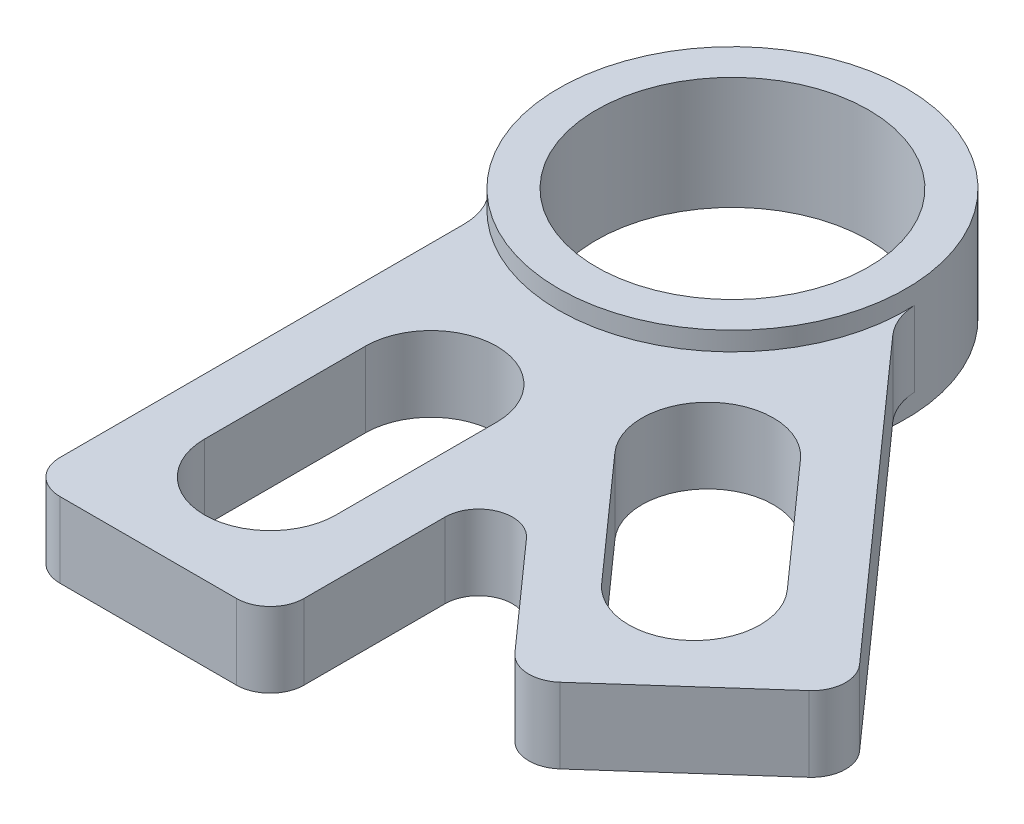
ISO-10303-21;
HEADER;
FILE_DESCRIPTION(('STEP AP214'),'2;1');
FILE_NAME('part.step','',(''),(''),'','','');
FILE_SCHEMA(('AUTOMOTIVE_DESIGN { 1 0 10303 214 1 1 1 1 }'));
ENDSEC;
DATA;
#1=APPLICATION_CONTEXT('core data for automotive mechanical design processes');
#2=APPLICATION_PROTOCOL_DEFINITION('international standard','automotive_design',2000,#1);
#3=PRODUCT_CONTEXT('',#1,'mechanical');
#4=PRODUCT('Part','Part','',(#3));
#5=PRODUCT_RELATED_PRODUCT_CATEGORY('part','',(#4));
#6=PRODUCT_DEFINITION_FORMATION('','',#4);
#7=PRODUCT_DEFINITION_CONTEXT('part definition',#1,'design');
#8=PRODUCT_DEFINITION('design','',#6,#7);
#9=PRODUCT_DEFINITION_SHAPE('','',#8);
#10=(LENGTH_UNIT() NAMED_UNIT(*) SI_UNIT(.MILLI.,.METRE.));
#11=(NAMED_UNIT(*) PLANE_ANGLE_UNIT() SI_UNIT($,.RADIAN.));
#12=(NAMED_UNIT(*) SI_UNIT($,.STERADIAN.) SOLID_ANGLE_UNIT());
#13=UNCERTAINTY_MEASURE_WITH_UNIT(LENGTH_MEASURE(1.E-05),#10,'distance_accuracy_value','');
#14=(GEOMETRIC_REPRESENTATION_CONTEXT(3) GLOBAL_UNCERTAINTY_ASSIGNED_CONTEXT((#13)) GLOBAL_UNIT_ASSIGNED_CONTEXT((#10,
#11,#12)) REPRESENTATION_CONTEXT('',''));
#15=CARTESIAN_POINT('',(0.,0.,0.));
#16=DIRECTION('',(0.,0.,1.));
#17=DIRECTION('',(1.,0.,0.));
#18=AXIS2_PLACEMENT_3D('',#15,#16,#17);
#19=CARTESIAN_POINT('',(0.,4.7625,0.));
#20=DIRECTION('',(0.,-1.,0.));
#21=DIRECTION('',(0.,0.,-1.));
#22=AXIS2_PLACEMENT_3D('',#19,#20,#21);
#23=CYLINDRICAL_SURFACE('',#22,11.5062);
#24=CARTESIAN_POINT('',(0.,4.7625,0.));
#25=DIRECTION('',(0.,1.,0.));
#26=DIRECTION('',(0.,0.,1.));
#27=AXIS2_PLACEMENT_3D('',#24,#25,#26);
#28=CIRCLE('',#27,11.5062);
#29=CARTESIAN_POINT('',(0.,4.7625,-11.5062));
#30=VERTEX_POINT('',#29);
#31=EDGE_CURVE('E301',#30,#30,#28,.T.);
#32=CARTESIAN_POINT('',(0.,-4.7625,0.));
#33=DIRECTION('',(0.,1.,0.));
#34=DIRECTION('',(0.,0.,1.));
#35=AXIS2_PLACEMENT_3D('',#32,#33,#34);
#36=CIRCLE('',#35,11.5062);
#37=CARTESIAN_POINT('',(0.,-4.7625,-11.5062));
#38=VERTEX_POINT('',#37);
#39=EDGE_CURVE('E296',#38,#38,#36,.T.);
#40=CARTESIAN_POINT('',(0.,4.7625,-11.5062));
#41=CARTESIAN_POINT('',(0.,4.66328125,-11.5062));
#42=CARTESIAN_POINT('',(0.,4.5640625,-11.5062));
#43=CARTESIAN_POINT('',(0.,4.365625,-11.5062));
#44=CARTESIAN_POINT('',(0.,4.26640625,-11.5062));
#45=CARTESIAN_POINT('',(0.,4.06796875,-11.5062));
#46=CARTESIAN_POINT('',(0.,3.96875,-11.5062));
#47=CARTESIAN_POINT('',(0.,3.7703125,-11.5062));
#48=CARTESIAN_POINT('',(0.,3.67109375,-11.5062));
#49=CARTESIAN_POINT('',(0.,3.47265625,-11.5062));
#50=CARTESIAN_POINT('',(0.,3.3734375,-11.5062));
#51=CARTESIAN_POINT('',(0.,3.175,-11.5062));
#52=CARTESIAN_POINT('',(0.,3.07578125,-11.5062));
#53=CARTESIAN_POINT('',(0.,2.87734375,-11.5062));
#54=CARTESIAN_POINT('',(0.,2.778125,-11.5062));
#55=CARTESIAN_POINT('',(0.,2.5796875,-11.5062));
#56=CARTESIAN_POINT('',(0.,2.48046875,-11.5062));
#57=CARTESIAN_POINT('',(0.,2.28203125,-11.5062));
#58=CARTESIAN_POINT('',(0.,2.1828125,-11.5062));
#59=CARTESIAN_POINT('',(0.,1.984375,-11.5062));
#60=CARTESIAN_POINT('',(0.,1.88515625,-11.5062));
#61=CARTESIAN_POINT('',(0.,1.68671875,-11.5062));
#62=CARTESIAN_POINT('',(0.,1.5875,-11.5062));
#63=CARTESIAN_POINT('',(0.,1.3890625,-11.5062));
#64=CARTESIAN_POINT('',(0.,1.28984375,-11.5062));
#65=CARTESIAN_POINT('',(0.,1.09140625,-11.5062));
#66=CARTESIAN_POINT('',(0.,0.992187499999999,-11.5062));
#67=CARTESIAN_POINT('',(0.,0.79375,-11.5062));
#68=CARTESIAN_POINT('',(0.,0.69453125,-11.5062));
#69=CARTESIAN_POINT('',(0.,0.49609375,-11.5062));
#70=CARTESIAN_POINT('',(0.,0.396875,-11.5062));
#71=CARTESIAN_POINT('',(0.,0.1984375,-11.5062));
#72=CARTESIAN_POINT('',(0.,0.0992187500000001,-11.5062));
#73=CARTESIAN_POINT('',(0.,-0.0992187500000001,-11.5062));
#74=CARTESIAN_POINT('',(0.,-0.1984375,-11.5062));
#75=CARTESIAN_POINT('',(0.,-0.396875,-11.5062));
#76=CARTESIAN_POINT('',(0.,-0.49609375,-11.5062));
#77=CARTESIAN_POINT('',(0.,-0.69453125,-11.5062));
#78=CARTESIAN_POINT('',(0.,-0.793750000000001,-11.5062));
#79=CARTESIAN_POINT('',(0.,-0.992187500000001,-11.5062));
#80=CARTESIAN_POINT('',(0.,-1.09140625,-11.5062));
#81=CARTESIAN_POINT('',(0.,-1.28984375,-11.5062));
#82=CARTESIAN_POINT('',(0.,-1.3890625,-11.5062));
#83=CARTESIAN_POINT('',(0.,-1.5875,-11.5062));
#84=CARTESIAN_POINT('',(0.,-1.68671875,-11.5062));
#85=CARTESIAN_POINT('',(0.,-1.88515625,-11.5062));
#86=CARTESIAN_POINT('',(0.,-1.984375,-11.5062));
#87=CARTESIAN_POINT('',(0.,-2.1828125,-11.5062));
#88=CARTESIAN_POINT('',(0.,-2.28203125,-11.5062));
#89=CARTESIAN_POINT('',(0.,-2.48046875,-11.5062));
#90=CARTESIAN_POINT('',(0.,-2.5796875,-11.5062));
#91=CARTESIAN_POINT('',(0.,-2.778125,-11.5062));
#92=CARTESIAN_POINT('',(0.,-2.87734375,-11.5062));
#93=CARTESIAN_POINT('',(0.,-3.07578125,-11.5062));
#94=CARTESIAN_POINT('',(0.,-3.175,-11.5062));
#95=CARTESIAN_POINT('',(0.,-3.3734375,-11.5062));
#96=CARTESIAN_POINT('',(0.,-3.47265625,-11.5062));
#97=CARTESIAN_POINT('',(0.,-3.67109375,-11.5062));
#98=CARTESIAN_POINT('',(0.,-3.7703125,-11.5062));
#99=CARTESIAN_POINT('',(0.,-3.96875,-11.5062));
#100=CARTESIAN_POINT('',(0.,-4.06796875,-11.5062));
#101=CARTESIAN_POINT('',(0.,-4.26640625,-11.5062));
#102=CARTESIAN_POINT('',(0.,-4.365625,-11.5062));
#103=CARTESIAN_POINT('',(0.,-4.5640625,-11.5062));
#104=CARTESIAN_POINT('',(0.,-4.66328125,-11.5062));
#105=CARTESIAN_POINT('',(0.,-4.7625,-11.5062));
#106=B_SPLINE_CURVE_WITH_KNOTS('',3,(#40,#41,#42,#43,#44,#45,#46,#47,#48,#49,#50,#51,#52,#53,
#54,#55,#56,#57,#58,#59,#60,#61,#62,#63,#64,#65,#66,#67,#68,#69,#70,#71,#72,#73,#74,#75,#76,#77,
#78,#79,#80,#81,#82,#83,#84,#85,#86,#87,#88,#89,#90,#91,#92,#93,#94,#95,#96,#97,#98,#99,#100,
#101,#102,#103,#104,#105),.UNSPECIFIED.,.F.,.F.,(4,2,2,2,2,2,2,2,2,2,2,2,2,2,2,2,2,2,2,2,2,2,2,
2,2,2,2,2,2,2,2,2,4),(0.,0.29765625,0.5953125,0.892968750000001,1.190625,1.48828125,1.7859375,
2.08359375,2.38125,2.67890625,2.9765625,3.27421875,3.571875,3.86953125,4.1671875,4.46484375,
4.7625,5.06015625,5.3578125,5.65546875,5.953125,6.25078125,6.5484375,6.84609375,7.14375,
7.44140625,7.7390625,8.03671875,8.334375,8.63203125,8.9296875,9.22734375,9.525),.UNSPECIFIED.);
#107=EDGE_CURVE('BSEAM43',#30,#38,#106,.T.);
#108=ORIENTED_EDGE('',*,*,#31,.T.);
#109=ORIENTED_EDGE('',*,*,#39,.F.);
#110=ORIENTED_EDGE('',*,*,#107,.T.);
#111=ORIENTED_EDGE('',*,*,#107,.F.);
#112=EDGE_LOOP('',(#108,#110,#109,#111));
#113=FACE_BOUND('',#112,.T.);
#114=ADVANCED_FACE('F43',(#113),#23,.F.);
#115=CARTESIAN_POINT('',(0.,4.7625,0.));
#116=DIRECTION('',(0.,-1.,0.));
#117=DIRECTION('',(0.,0.,-1.));
#118=AXIS2_PLACEMENT_3D('',#115,#116,#117);
#119=CYLINDRICAL_SURFACE('',#118,14.6812);
#120=DIRECTION('',(0.,-1.,0.));
#121=VECTOR('',#120,1.);
#122=CARTESIAN_POINT('',(14.6629051138909,4.7625,-0.7326984789337));
#123=LINE('',#122,#121);
#124=CARTESIAN_POINT('',(14.6629051138909,3.175,-0.7326984789337));
#125=VERTEX_POINT('',#124);
#126=CARTESIAN_POINT('',(14.6629051138909,-3.175,-0.7326984789337));
#127=VERTEX_POINT('',#126);
#128=EDGE_CURVE('E315',#125,#127,#123,.T.);
#129=ORIENTED_EDGE('',*,*,#128,.T.);
#130=CARTESIAN_POINT('',(0.,-3.175,0.));
#131=DIRECTION('',(0.,1.,0.));
#132=DIRECTION('',(0.,0.,1.));
#133=AXIS2_PLACEMENT_3D('',#130,#131,#132);
#134=CIRCLE('',#133,14.6812);
#135=CARTESIAN_POINT('',(-11.4402024421594,-3.175,9.20105437014751));
#136=VERTEX_POINT('',#135);
#137=EDGE_CURVE('E272',#136,#127,#134,.T.);
#138=ORIENTED_EDGE('',*,*,#137,.F.);
#139=DIRECTION('',(0.,-1.,0.));
#140=VECTOR('',#139,1.);
#141=CARTESIAN_POINT('',(-11.4402024421594,4.7625,9.20105437014751));
#142=LINE('',#141,#140);
#143=CARTESIAN_POINT('',(-11.4402024421594,3.175,9.20105437014751));
#144=VERTEX_POINT('',#143);
#145=EDGE_CURVE('E308',#136,#144,#142,.F.);
#146=ORIENTED_EDGE('',*,*,#145,.T.);
#147=CARTESIAN_POINT('',(0.,3.175,0.));
#148=DIRECTION('',(0.,1.,0.));
#149=DIRECTION('',(0.,0.,1.));
#150=AXIS2_PLACEMENT_3D('',#147,#148,#149);
#151=CIRCLE('',#150,14.6812);
#152=EDGE_CURVE('E234',#144,#125,#151,.T.);
#153=ORIENTED_EDGE('',*,*,#152,.T.);
#154=EDGE_LOOP('',(#129,#138,#146,#153));
#155=FACE_BOUND('',#154,.T.);
#156=CARTESIAN_POINT('',(0.,4.7625,0.));
#157=DIRECTION('',(0.,1.,0.));
#158=DIRECTION('',(0.,0.,1.));
#159=AXIS2_PLACEMENT_3D('',#156,#157,#158);
#160=CIRCLE('',#159,14.6812);
#161=CARTESIAN_POINT('',(0.,4.7625,14.6812));
#162=VERTEX_POINT('',#161);
#163=EDGE_CURVE('E304',#162,#162,#160,.T.);
#164=ORIENTED_EDGE('',*,*,#163,.F.);
#165=EDGE_LOOP('',(#164));
#166=FACE_BOUND('',#165,.T.);
#167=CARTESIAN_POINT('',(0.,-4.7625,0.));
#168=DIRECTION('',(0.,1.,0.));
#169=DIRECTION('',(0.,0.,1.));
#170=AXIS2_PLACEMENT_3D('',#167,#168,#169);
#171=CIRCLE('',#170,14.6812);
#172=CARTESIAN_POINT('',(0.,-4.7625,14.6812));
#173=VERTEX_POINT('',#172);
#174=EDGE_CURVE('E305',#173,#173,#171,.T.);
#175=ORIENTED_EDGE('',*,*,#174,.T.);
#176=EDGE_LOOP('',(#175));
#177=FACE_BOUND('',#176,.T.);
#178=ADVANCED_FACE('F411',(#155,#166,#177),#119,.T.);
#179=CARTESIAN_POINT('',(0.,4.7625,0.));
#180=DIRECTION('',(0.,1.,0.));
#181=DIRECTION('',(0.,0.,1.));
#182=AXIS2_PLACEMENT_3D('',#179,#180,#181);
#183=PLANE('',#182);
#184=ORIENTED_EDGE('',*,*,#31,.F.);
#185=EDGE_LOOP('',(#184));
#186=FACE_BOUND('',#185,.T.);
#187=ORIENTED_EDGE('',*,*,#163,.T.);
#188=EDGE_LOOP('',(#187));
#189=FACE_BOUND('',#188,.T.);
#190=ADVANCED_FACE('F447',(#186,#189),#183,.T.);
#191=CARTESIAN_POINT('',(0.,-4.7625,0.));
#192=DIRECTION('',(0.,1.,0.));
#193=DIRECTION('',(0.,0.,1.));
#194=AXIS2_PLACEMENT_3D('',#191,#192,#193);
#195=PLANE('',#194);
#196=ORIENTED_EDGE('',*,*,#39,.T.);
#197=EDGE_LOOP('',(#196));
#198=FACE_BOUND('',#197,.T.);
#199=ORIENTED_EDGE('',*,*,#174,.F.);
#200=EDGE_LOOP('',(#199));
#201=FACE_BOUND('',#200,.T.);
#202=ADVANCED_FACE('F621',(#198,#201),#195,.F.);
#203=CARTESIAN_POINT('',(-10.31875,3.175,0.));
#204=DIRECTION('',(-1.,0.,0.));
#205=DIRECTION('',(0.,0.,1.));
#206=AXIS2_PLACEMENT_3D('',#203,#204,#205);
#207=PLANE('',#206);
#208=DIRECTION('',(0.,0.,-1.));
#209=VECTOR('',#208,1.);
#210=CARTESIAN_POINT('',(-10.31875,-3.175,0.));
#211=LINE('',#210,#209);
#212=CARTESIAN_POINT('',(-10.31875,-3.175,46.5328));
#213=VERTEX_POINT('',#212);
#214=CARTESIAN_POINT('',(-10.31875,-3.175,12.3848102075688));
#215=VERTEX_POINT('',#214);
#216=EDGE_CURVE('E274',#213,#215,#211,.T.);
#217=ORIENTED_EDGE('',*,*,#216,.F.);
#218=DIRECTION('',(0.,-1.,0.));
#219=VECTOR('',#218,1.);
#220=CARTESIAN_POINT('',(-10.31875,3.175,46.5328));
#221=LINE('',#220,#219);
#222=CARTESIAN_POINT('',(-10.31875,3.175,46.5328));
#223=VERTEX_POINT('',#222);
#224=EDGE_CURVE('E374',#213,#223,#221,.F.);
#225=ORIENTED_EDGE('',*,*,#224,.T.);
#226=DIRECTION('',(0.,0.,-1.));
#227=VECTOR('',#226,1.);
#228=CARTESIAN_POINT('',(-10.31875,3.175,0.));
#229=LINE('',#228,#227);
#230=CARTESIAN_POINT('',(-10.31875,3.175,12.3848102075688));
#231=VERTEX_POINT('',#230);
#232=EDGE_CURVE('E236',#223,#231,#229,.T.);
#233=ORIENTED_EDGE('',*,*,#232,.T.);
#234=DIRECTION('',(0.,-1.,0.));
#235=VECTOR('',#234,1.);
#236=CARTESIAN_POINT('',(-10.31875,3.175,12.3848102075688));
#237=LINE('',#236,#235);
#238=EDGE_CURVE('E321',#231,#215,#237,.T.);
#239=ORIENTED_EDGE('',*,*,#238,.T.);
#240=EDGE_LOOP('',(#217,#225,#233,#239));
#241=FACE_BOUND('',#240,.T.);
#242=ADVANCED_FACE('F613',(#241),#207,.T.);
#243=CARTESIAN_POINT('',(0.,3.175,49.3903));
#244=DIRECTION('',(0.,0.,-1.));
#245=DIRECTION('',(-1.,0.,0.));
#246=AXIS2_PLACEMENT_3D('',#243,#244,#245);
#247=PLANE('',#246);
#248=DIRECTION('',(1.,0.,0.));
#249=VECTOR('',#248,1.);
#250=CARTESIAN_POINT('',(0.,-3.175,49.3903));
#251=LINE('',#250,#249);
#252=CARTESIAN_POINT('',(-7.46124999999999,-3.175,49.3903));
#253=VERTEX_POINT('',#252);
#254=CARTESIAN_POINT('',(7.46125000000001,-3.175,49.3903));
#255=VERTEX_POINT('',#254);
#256=EDGE_CURVE('E276',#253,#255,#251,.T.);
#257=ORIENTED_EDGE('',*,*,#256,.T.);
#258=DIRECTION('',(0.,-1.,0.));
#259=VECTOR('',#258,1.);
#260=CARTESIAN_POINT('',(7.46125000000001,3.175,49.3903));
#261=LINE('',#260,#259);
#262=CARTESIAN_POINT('',(7.46125000000001,3.175,49.3903));
#263=VERTEX_POINT('',#262);
#264=EDGE_CURVE('E372',#255,#263,#261,.F.);
#265=ORIENTED_EDGE('',*,*,#264,.T.);
#266=DIRECTION('',(1.,0.,0.));
#267=VECTOR('',#266,1.);
#268=CARTESIAN_POINT('',(0.,3.175,49.3903));
#269=LINE('',#268,#267);
#270=CARTESIAN_POINT('',(-7.46124999999999,3.175,49.3903));
#271=VERTEX_POINT('',#270);
#272=EDGE_CURVE('E238',#271,#263,#269,.T.);
#273=ORIENTED_EDGE('',*,*,#272,.F.);
#274=DIRECTION('',(0.,-1.,0.));
#275=VECTOR('',#274,1.);
#276=CARTESIAN_POINT('',(-7.46124999999999,-3.175,49.3903));
#277=LINE('',#276,#275);
#278=EDGE_CURVE('E369',#271,#253,#277,.T.);
#279=ORIENTED_EDGE('',*,*,#278,.T.);
#280=EDGE_LOOP('',(#257,#265,#273,#279));
#281=FACE_BOUND('',#280,.T.);
#282=ADVANCED_FACE('F428',(#281),#247,.F.);
#283=CARTESIAN_POINT('',(10.31875,3.175,0.));
#284=DIRECTION('',(-1.,0.,0.));
#285=DIRECTION('',(0.,0.,1.));
#286=AXIS2_PLACEMENT_3D('',#283,#284,#285);
#287=PLANE('',#286);
#288=DIRECTION('',(0.,0.,-1.));
#289=VECTOR('',#288,1.);
#290=CARTESIAN_POINT('',(10.31875,-3.175,0.));
#291=LINE('',#290,#289);
#292=CARTESIAN_POINT('',(10.31875,-3.175,46.5328));
#293=VERTEX_POINT('',#292);
#294=CARTESIAN_POINT('',(10.31875,-3.175,34.6234777692486));
#295=VERTEX_POINT('',#294);
#296=EDGE_CURVE('E279',#293,#295,#291,.T.);
#297=ORIENTED_EDGE('',*,*,#296,.T.);
#298=DIRECTION('',(0.,-1.,0.));
#299=VECTOR('',#298,1.);
#300=CARTESIAN_POINT('',(10.31875,3.175,34.6234777692486));
#301=LINE('',#300,#299);
#302=CARTESIAN_POINT('',(10.31875,3.175,34.6234777692486));
#303=VERTEX_POINT('',#302);
#304=EDGE_CURVE('E367',#295,#303,#301,.F.);
#305=ORIENTED_EDGE('',*,*,#304,.T.);
#306=DIRECTION('',(0.,0.,-1.));
#307=VECTOR('',#306,1.);
#308=CARTESIAN_POINT('',(10.31875,3.175,0.));
#309=LINE('',#308,#307);
#310=CARTESIAN_POINT('',(10.31875,3.175,46.5328));
#311=VERTEX_POINT('',#310);
#312=EDGE_CURVE('E241',#311,#303,#309,.T.);
#313=ORIENTED_EDGE('',*,*,#312,.F.);
#314=DIRECTION('',(0.,-1.,0.));
#315=VECTOR('',#314,1.);
#316=CARTESIAN_POINT('',(10.31875,3.175,46.5328));
#317=LINE('',#316,#315);
#318=EDGE_CURVE('E364',#311,#293,#317,.T.);
#319=ORIENTED_EDGE('',*,*,#318,.T.);
#320=EDGE_LOOP('',(#297,#305,#313,#319));
#321=FACE_BOUND('',#320,.T.);
#322=ADVANCED_FACE('F383',(#321),#287,.F.);
#323=CARTESIAN_POINT('',(-7.70802927607697,3.175,6.86023951780406));
#324=DIRECTION('',(-0.746992540382989,0.,0.664832418442549));
#325=DIRECTION('',(0.664832418442549,0.,0.746992540382989));
#326=AXIS2_PLACEMENT_3D('',#323,#324,#325);
#327=PLANE('',#326);
#328=DIRECTION('',(-0.664832418442549,0.,-0.746992540382989));
#329=VECTOR('',#328,1.);
#330=CARTESIAN_POINT('',(-7.70802927607697,-3.175,6.86023951780406));
#331=LINE('',#330,#329);
#332=CARTESIAN_POINT('',(23.2284846848265,-3.175,41.6198940009376));
#333=VERTEX_POINT('',#332);
#334=CARTESIAN_POINT('',(15.3107811841444,-3.175,32.723719133549));
#335=VERTEX_POINT('',#334);
#336=EDGE_CURVE('E282',#333,#335,#331,.T.);
#337=ORIENTED_EDGE('',*,*,#336,.F.);
#338=DIRECTION('',(0.,-1.,0.));
#339=VECTOR('',#338,1.);
#340=CARTESIAN_POINT('',(23.2284846848265,3.175,41.6198940009376));
#341=LINE('',#340,#339);
#342=CARTESIAN_POINT('',(23.2284846848265,3.175,41.6198940009376));
#343=VERTEX_POINT('',#342);
#344=EDGE_CURVE('E63',#333,#343,#341,.F.);
#345=ORIENTED_EDGE('',*,*,#344,.T.);
#346=DIRECTION('',(-0.664832418442549,0.,-0.746992540382989));
#347=VECTOR('',#346,1.);
#348=CARTESIAN_POINT('',(-7.70802927607697,3.175,6.86023951780406));
#349=LINE('',#348,#347);
#350=CARTESIAN_POINT('',(15.3107811841444,3.175,32.723719133549));
#351=VERTEX_POINT('',#350);
#352=EDGE_CURVE('E243',#343,#351,#349,.T.);
#353=ORIENTED_EDGE('',*,*,#352,.T.);
#354=DIRECTION('',(0.,-1.,0.));
#355=VECTOR('',#354,1.);
#356=CARTESIAN_POINT('',(15.3107811841444,3.175,32.723719133549));
#357=LINE('',#356,#355);
#358=EDGE_CURVE('E360',#351,#335,#357,.T.);
#359=ORIENTED_EDGE('',*,*,#358,.T.);
#360=EDGE_LOOP('',(#337,#345,#353,#359));
#361=FACE_BOUND('',#360,.T.);
#362=ADVANCED_FACE('F387',(#361),#327,.T.);
#363=CARTESIAN_POINT('',(32.836272596603,3.175,36.894185667278));
#364=DIRECTION('',(-0.664832418442549,0.,-0.746992540382989));
#365=DIRECTION('',(-0.746992540382989,0.,0.664832418442549));
#366=AXIS2_PLACEMENT_3D('',#363,#364,#365);
#367=PLANE('',#366);
#368=DIRECTION('',(0.746992540382989,0.,-0.664832418442549));
#369=VECTOR('',#368,1.);
#370=CARTESIAN_POINT('',(32.836272596603,-3.175,36.894185667278));
#371=LINE('',#370,#369);
#372=CARTESIAN_POINT('',(27.2627745046705,-3.175,41.8546665493824));
#373=VERTEX_POINT('',#372);
#374=CARTESIAN_POINT('',(38.4097706885356,-3.175,31.9337047851735));
#375=VERTEX_POINT('',#374);
#376=EDGE_CURVE('E285',#373,#375,#371,.T.);
#377=ORIENTED_EDGE('',*,*,#376,.T.);
#378=DIRECTION('',(0.,-1.,0.));
#379=VECTOR('',#378,1.);
#380=CARTESIAN_POINT('',(38.4097706885356,3.175,31.9337047851735));
#381=LINE('',#380,#379);
#382=CARTESIAN_POINT('',(38.4097706885356,3.175,31.9337047851735));
#383=VERTEX_POINT('',#382);
#384=EDGE_CURVE('E350',#375,#383,#381,.F.);
#385=ORIENTED_EDGE('',*,*,#384,.T.);
#386=DIRECTION('',(0.746992540382989,0.,-0.664832418442549));
#387=VECTOR('',#386,1.);
#388=CARTESIAN_POINT('',(32.836272596603,3.175,36.894185667278));
#389=LINE('',#388,#387);
#390=CARTESIAN_POINT('',(27.2627745046705,3.175,41.8546665493824));
#391=VERTEX_POINT('',#390);
#392=EDGE_CURVE('E245',#391,#383,#389,.T.);
#393=ORIENTED_EDGE('',*,*,#392,.F.);
#394=DIRECTION('',(0.,-1.,0.));
#395=VECTOR('',#394,1.);
#396=CARTESIAN_POINT('',(27.2627745046705,-3.175,41.8546665493824));
#397=LINE('',#396,#395);
#398=EDGE_CURVE('E347',#391,#373,#397,.T.);
#399=ORIENTED_EDGE('',*,*,#398,.T.);
#400=EDGE_LOOP('',(#377,#385,#393,#399));
#401=FACE_BOUND('',#400,.T.);
#402=ADVANCED_FACE('F395',(#401),#367,.F.);
#403=CARTESIAN_POINT('',(0.,3.175,25.48255));
#404=DIRECTION('',(0.,-1.,0.));
#405=DIRECTION('',(0.,0.,-1.));
#406=AXIS2_PLACEMENT_3D('',#403,#404,#405);
#407=CYLINDRICAL_SURFACE('',#406,5.55625);
#408=CARTESIAN_POINT('',(0.,-3.175,25.48255));
#409=DIRECTION('',(0.,1.,0.));
#410=DIRECTION('',(0.,0.,1.));
#411=AXIS2_PLACEMENT_3D('',#408,#409,#410);
#412=CIRCLE('',#411,5.55625);
#413=CARTESIAN_POINT('',(5.55625,-3.175,25.48255));
#414=VERTEX_POINT('',#413);
#415=CARTESIAN_POINT('',(-5.55624999999999,-3.175,25.48255));
#416=VERTEX_POINT('',#415);
#417=EDGE_CURVE('E260',#414,#416,#412,.T.);
#418=ORIENTED_EDGE('',*,*,#417,.F.);
#419=DIRECTION('',(0.,-1.,0.));
#420=VECTOR('',#419,1.);
#421=CARTESIAN_POINT('',(5.55625,3.175,25.48255));
#422=LINE('',#421,#420);
#423=CARTESIAN_POINT('',(5.55625,3.175,25.48255));
#424=VERTEX_POINT('',#423);
#425=EDGE_CURVE('E294',#424,#414,#422,.T.);
#426=ORIENTED_EDGE('',*,*,#425,.F.);
#427=CARTESIAN_POINT('',(0.,3.175,25.48255));
#428=DIRECTION('',(0.,1.,0.));
#429=DIRECTION('',(0.,0.,1.));
#430=AXIS2_PLACEMENT_3D('',#427,#428,#429);
#431=CIRCLE('',#430,5.55625);
#432=CARTESIAN_POINT('',(-5.55624999999999,3.175,25.48255));
#433=VERTEX_POINT('',#432);
#434=EDGE_CURVE('E223',#424,#433,#431,.T.);
#435=ORIENTED_EDGE('',*,*,#434,.T.);
#436=DIRECTION('',(0.,-1.,0.));
#437=VECTOR('',#436,1.);
#438=CARTESIAN_POINT('',(-5.55624999999999,3.175,25.48255));
#439=LINE('',#438,#437);
#440=EDGE_CURVE('E202',#433,#416,#439,.T.);
#441=ORIENTED_EDGE('',*,*,#440,.T.);
#442=EDGE_LOOP('',(#418,#426,#435,#441));
#443=FACE_BOUND('',#442,.T.);
#444=ADVANCED_FACE('F575',(#443),#407,.F.);
#445=CARTESIAN_POINT('',(5.55625,3.175,0.));
#446=DIRECTION('',(-1.,0.,0.));
#447=DIRECTION('',(0.,0.,1.));
#448=AXIS2_PLACEMENT_3D('',#445,#446,#447);
#449=PLANE('',#448);
#450=DIRECTION('',(0.,0.,-1.));
#451=VECTOR('',#450,1.);
#452=CARTESIAN_POINT('',(5.55625,-3.175,0.));
#453=LINE('',#452,#451);
#454=CARTESIAN_POINT('',(5.55625,-3.175,39.07155));
#455=VERTEX_POINT('',#454);
#456=EDGE_CURVE('E263',#455,#414,#453,.T.);
#457=ORIENTED_EDGE('',*,*,#456,.F.);
#458=DIRECTION('',(0.,-1.,0.));
#459=VECTOR('',#458,1.);
#460=CARTESIAN_POINT('',(5.55625,3.175,39.07155));
#461=LINE('',#460,#459);
#462=CARTESIAN_POINT('',(5.55625,3.175,39.07155));
#463=VERTEX_POINT('',#462);
#464=EDGE_CURVE('E292',#463,#455,#461,.T.);
#465=ORIENTED_EDGE('',*,*,#464,.F.);
#466=DIRECTION('',(0.,0.,-1.));
#467=VECTOR('',#466,1.);
#468=CARTESIAN_POINT('',(5.55625,3.175,0.));
#469=LINE('',#468,#467);
#470=EDGE_CURVE('E226',#463,#424,#469,.T.);
#471=ORIENTED_EDGE('',*,*,#470,.T.);
#472=ORIENTED_EDGE('',*,*,#425,.T.);
#473=EDGE_LOOP('',(#457,#465,#471,#472));
#474=FACE_BOUND('',#473,.T.);
#475=ADVANCED_FACE('F566',(#474),#449,.T.);
#476=CARTESIAN_POINT('',(0.,3.175,39.07155));
#477=DIRECTION('',(0.,-1.,0.));
#478=DIRECTION('',(0.,0.,-1.));
#479=AXIS2_PLACEMENT_3D('',#476,#477,#478);
#480=CYLINDRICAL_SURFACE('',#479,5.55625);
#481=CARTESIAN_POINT('',(0.,-3.175,39.07155));
#482=DIRECTION('',(0.,1.,0.));
#483=DIRECTION('',(0.,0.,1.));
#484=AXIS2_PLACEMENT_3D('',#481,#482,#483);
#485=CIRCLE('',#484,5.55625);
#486=CARTESIAN_POINT('',(-5.55625,-3.175,39.07155));
#487=VERTEX_POINT('',#486);
#488=EDGE_CURVE('E266',#487,#455,#485,.T.);
#489=ORIENTED_EDGE('',*,*,#488,.F.);
#490=DIRECTION('',(0.,-1.,0.));
#491=VECTOR('',#490,1.);
#492=CARTESIAN_POINT('',(-5.55625,3.175,39.07155));
#493=LINE('',#492,#491);
#494=CARTESIAN_POINT('',(-5.55625,3.175,39.07155));
#495=VERTEX_POINT('',#494);
#496=EDGE_CURVE('E290',#495,#487,#493,.T.);
#497=ORIENTED_EDGE('',*,*,#496,.F.);
#498=CARTESIAN_POINT('',(0.,3.175,39.07155));
#499=DIRECTION('',(0.,1.,0.));
#500=DIRECTION('',(0.,0.,1.));
#501=AXIS2_PLACEMENT_3D('',#498,#499,#500);
#502=CIRCLE('',#501,5.55625);
#503=EDGE_CURVE('E229',#495,#463,#502,.T.);
#504=ORIENTED_EDGE('',*,*,#503,.T.);
#505=ORIENTED_EDGE('',*,*,#464,.T.);
#506=EDGE_LOOP('',(#489,#497,#504,#505));
#507=FACE_BOUND('',#506,.T.);
#508=ADVANCED_FACE('F558',(#507),#480,.F.);
#509=CARTESIAN_POINT('',(16.9416253445825,3.175,19.0352747599371));
#510=DIRECTION('',(0.,-1.,0.));
#511=DIRECTION('',(0.,0.,-1.));
#512=AXIS2_PLACEMENT_3D('',#509,#510,#511);
#513=CYLINDRICAL_SURFACE('',#512,5.55625000000044);
#514=CARTESIAN_POINT('',(16.9416253445825,-3.175,19.0352747599371));
#515=DIRECTION('',(0.,1.,0.));
#516=DIRECTION('',(0.,0.,1.));
#517=AXIS2_PLACEMENT_3D('',#514,#515,#516);
#518=CIRCLE('',#517,5.55625000000044);
#519=CARTESIAN_POINT('',(21.0921026470862,-3.175,15.3412996349651));
#520=VERTEX_POINT('',#519);
#521=CARTESIAN_POINT('',(12.7911480420796,-3.175,22.7292498849085));
#522=VERTEX_POINT('',#521);
#523=EDGE_CURVE('E197',#520,#522,#518,.T.);
#524=ORIENTED_EDGE('',*,*,#523,.F.);
#525=DIRECTION('',(0.,-1.,0.));
#526=VECTOR('',#525,1.);
#527=CARTESIAN_POINT('',(21.0921026470862,3.175,15.3412996349651));
#528=LINE('',#527,#526);
#529=CARTESIAN_POINT('',(21.0921026470862,3.175,15.3412996349651));
#530=VERTEX_POINT('',#529);
#531=EDGE_CURVE('E192',#530,#520,#528,.T.);
#532=ORIENTED_EDGE('',*,*,#531,.F.);
#533=CARTESIAN_POINT('',(16.9416253445825,3.175,19.0352747599371));
#534=DIRECTION('',(0.,1.,0.));
#535=DIRECTION('',(0.,0.,1.));
#536=AXIS2_PLACEMENT_3D('',#533,#534,#535);
#537=CIRCLE('',#536,5.55625000000044);
#538=CARTESIAN_POINT('',(12.7911480420796,3.175,22.7292498849085));
#539=VERTEX_POINT('',#538);
#540=EDGE_CURVE('E195',#530,#539,#537,.T.);
#541=ORIENTED_EDGE('',*,*,#540,.T.);
#542=DIRECTION('',(0.,-1.,0.));
#543=VECTOR('',#542,1.);
#544=CARTESIAN_POINT('',(12.7911480420796,3.175,22.7292498849085));
#545=LINE('',#544,#543);
#546=EDGE_CURVE('E250',#539,#522,#545,.T.);
#547=ORIENTED_EDGE('',*,*,#546,.T.);
#548=EDGE_LOOP('',(#524,#532,#541,#547));
#549=FACE_BOUND('',#548,.T.);
#550=ADVANCED_FACE('F194',(#549),#513,.F.);
#551=CARTESIAN_POINT('',(4.15047730250302,3.175,-3.69397512497144));
#552=DIRECTION('',(-0.746992540382989,0.,0.664832418442548));
#553=DIRECTION('',(0.664832418442549,0.,0.746992540382989));
#554=AXIS2_PLACEMENT_3D('',#551,#552,#553);
#555=PLANE('',#554);
#556=DIRECTION('',(-0.664832418442549,0.,-0.746992540382989));
#557=VECTOR('',#556,1.);
#558=CARTESIAN_POINT('',(4.15047730250302,-3.175,-3.69397512497144));
#559=LINE('',#558,#557);
#560=CARTESIAN_POINT('',(30.126510381302,-3.175,25.4921812662296));
#561=VERTEX_POINT('',#560);
#562=EDGE_CURVE('E252',#561,#520,#559,.T.);
#563=ORIENTED_EDGE('',*,*,#562,.F.);
#564=DIRECTION('',(0.,-1.,0.));
#565=VECTOR('',#564,1.);
#566=CARTESIAN_POINT('',(30.126510381302,3.175,25.4921812662296));
#567=LINE('',#566,#565);
#568=CARTESIAN_POINT('',(30.126510381302,3.175,25.4921812662296));
#569=VERTEX_POINT('',#568);
#570=EDGE_CURVE('E203',#569,#561,#567,.T.);
#571=ORIENTED_EDGE('',*,*,#570,.F.);
#572=DIRECTION('',(-0.664832418442549,0.,-0.746992540382989));
#573=VECTOR('',#572,1.);
#574=CARTESIAN_POINT('',(4.15047730250302,3.175,-3.69397512497144));
#575=LINE('',#574,#573);
#576=EDGE_CURVE('E210',#569,#530,#575,.T.);
#577=ORIENTED_EDGE('',*,*,#576,.T.);
#578=ORIENTED_EDGE('',*,*,#531,.T.);
#579=EDGE_LOOP('',(#563,#571,#577,#578));
#580=FACE_BOUND('',#579,.T.);
#581=ADVANCED_FACE('F217',(#580),#555,.T.);
#582=CARTESIAN_POINT('',(25.9760330787984,3.175,29.1861563912015));
#583=DIRECTION('',(0.,-1.,0.));
#584=DIRECTION('',(0.,0.,-1.));
#585=AXIS2_PLACEMENT_3D('',#582,#583,#584);
#586=CYLINDRICAL_SURFACE('',#585,5.55625000000043);
#587=CARTESIAN_POINT('',(25.9760330787984,-3.175,29.1861563912015));
#588=DIRECTION('',(0.,1.,0.));
#589=DIRECTION('',(0.,0.,1.));
#590=AXIS2_PLACEMENT_3D('',#587,#588,#589);
#591=CIRCLE('',#590,5.55625000000043);
#592=CARTESIAN_POINT('',(21.8255557762954,-3.175,32.880131516173));
#593=VERTEX_POINT('',#592);
#594=EDGE_CURVE('E254',#593,#561,#591,.T.);
#595=ORIENTED_EDGE('',*,*,#594,.F.);
#596=DIRECTION('',(0.,-1.,0.));
#597=VECTOR('',#596,1.);
#598=CARTESIAN_POINT('',(21.8255557762954,3.175,32.880131516173));
#599=LINE('',#598,#597);
#600=CARTESIAN_POINT('',(21.8255557762954,3.175,32.880131516173));
#601=VERTEX_POINT('',#600);
#602=EDGE_CURVE('E298',#601,#593,#599,.T.);
#603=ORIENTED_EDGE('',*,*,#602,.F.);
#604=CARTESIAN_POINT('',(25.9760330787984,3.175,29.1861563912015));
#605=DIRECTION('',(0.,1.,0.));
#606=DIRECTION('',(0.,0.,1.));
#607=AXIS2_PLACEMENT_3D('',#604,#605,#606);
#608=CIRCLE('',#607,5.55625000000043);
#609=EDGE_CURVE('E218',#601,#569,#608,.T.);
#610=ORIENTED_EDGE('',*,*,#609,.T.);
#611=ORIENTED_EDGE('',*,*,#570,.T.);
#612=EDGE_LOOP('',(#595,#603,#610,#611));
#613=FACE_BOUND('',#612,.T.);
#614=ADVANCED_FACE('F534',(#613),#586,.F.);
#615=CARTESIAN_POINT('',(-5.55624999999999,3.175,0.));
#616=DIRECTION('',(-1.,0.,0.));
#617=DIRECTION('',(0.,0.,1.));
#618=AXIS2_PLACEMENT_3D('',#615,#616,#617);
#619=PLANE('',#618);
#620=DIRECTION('',(0.,0.,-1.));
#621=VECTOR('',#620,1.);
#622=CARTESIAN_POINT('',(-5.55624999999999,-3.175,0.));
#623=LINE('',#622,#621);
#624=EDGE_CURVE('E269',#487,#416,#623,.T.);
#625=ORIENTED_EDGE('',*,*,#624,.T.);
#626=ORIENTED_EDGE('',*,*,#440,.F.);
#627=DIRECTION('',(0.,0.,-1.));
#628=VECTOR('',#627,1.);
#629=CARTESIAN_POINT('',(-5.55624999999999,3.175,0.));
#630=LINE('',#629,#628);
#631=EDGE_CURVE('E232',#495,#433,#630,.T.);
#632=ORIENTED_EDGE('',*,*,#631,.F.);
#633=ORIENTED_EDGE('',*,*,#496,.T.);
#634=EDGE_LOOP('',(#625,#626,#632,#633));
#635=FACE_BOUND('',#634,.T.);
#636=ADVANCED_FACE('F525',(#635),#619,.F.);
#637=CARTESIAN_POINT('',(-4.15047730250362,3.175,3.69397512497199));
#638=DIRECTION('',(-0.746992540382989,0.,0.664832418442549));
#639=DIRECTION('',(0.664832418442549,0.,0.746992540382989));
#640=AXIS2_PLACEMENT_3D('',#637,#638,#639);
#641=PLANE('',#640);
#642=DIRECTION('',(-0.664832418442549,0.,-0.746992540382989));
#643=VECTOR('',#642,1.);
#644=CARTESIAN_POINT('',(-4.15047730250362,-3.175,3.69397512497199));
#645=LINE('',#644,#643);
#646=EDGE_CURVE('E257',#593,#522,#645,.T.);
#647=ORIENTED_EDGE('',*,*,#646,.T.);
#648=ORIENTED_EDGE('',*,*,#546,.F.);
#649=DIRECTION('',(-0.664832418442549,0.,-0.746992540382989));
#650=VECTOR('',#649,1.);
#651=CARTESIAN_POINT('',(-4.15047730250362,3.175,3.69397512497199));
#652=LINE('',#651,#650);
#653=EDGE_CURVE('E213',#601,#539,#652,.T.);
#654=ORIENTED_EDGE('',*,*,#653,.F.);
#655=ORIENTED_EDGE('',*,*,#602,.T.);
#656=EDGE_LOOP('',(#647,#648,#654,#655));
#657=FACE_BOUND('',#656,.T.);
#658=ADVANCED_FACE('F517',(#657),#641,.F.);
#659=CARTESIAN_POINT('',(7.70802927607597,3.175,-6.86023951780349));
#660=DIRECTION('',(-0.746992540382973,0.,0.664832418442566));
#661=DIRECTION('',(0.664832418442566,0.,0.746992540382974));
#662=AXIS2_PLACEMENT_3D('',#659,#660,#661);
#663=PLANE('',#662);
#664=DIRECTION('',(-0.664832418442566,0.,-0.746992540382974));
#665=VECTOR('',#664,1.);
#666=CARTESIAN_POINT('',(7.70802927607597,3.175,-6.86023951780349));
#667=LINE('',#666,#665);
#668=CARTESIAN_POINT('',(38.6445432369803,3.175,27.8994149653295));
#669=VERTEX_POINT('',#668);
#670=CARTESIAN_POINT('',(15.941852598327,3.175,2.39112132131035));
#671=VERTEX_POINT('',#670);
#672=EDGE_CURVE('E248',#669,#671,#667,.T.);
#673=ORIENTED_EDGE('',*,*,#672,.F.);
#674=DIRECTION('',(0.,-1.,0.));
#675=VECTOR('',#674,1.);
#676=CARTESIAN_POINT('',(38.6445432369803,3.175,27.8994149653295));
#677=LINE('',#676,#675);
#678=CARTESIAN_POINT('',(38.6445432369803,-3.175,27.8994149653295));
#679=VERTEX_POINT('',#678);
#680=EDGE_CURVE('E336',#669,#679,#677,.T.);
#681=ORIENTED_EDGE('',*,*,#680,.T.);
#682=DIRECTION('',(-0.664832418442566,0.,-0.746992540382974));
#683=VECTOR('',#682,1.);
#684=CARTESIAN_POINT('',(7.70802927607597,-3.175,-6.86023951780349));
#685=LINE('',#684,#683);
#686=CARTESIAN_POINT('',(15.941852598327,-3.175,2.39112132131035));
#687=VERTEX_POINT('',#686);
#688=EDGE_CURVE('E215',#679,#687,#685,.T.);
#689=ORIENTED_EDGE('',*,*,#688,.T.);
#690=DIRECTION('',(0.,1.,0.));
#691=VECTOR('',#690,1.);
#692=CARTESIAN_POINT('',(15.941852598327,3.175,2.39112132131035));
#693=LINE('',#692,#691);
#694=EDGE_CURVE('E318',#687,#671,#693,.T.);
#695=ORIENTED_EDGE('',*,*,#694,.T.);
#696=EDGE_LOOP('',(#673,#681,#689,#695));
#697=FACE_BOUND('',#696,.T.);
#698=ADVANCED_FACE('F403',(#697),#663,.F.);
#699=CARTESIAN_POINT('',(0.,3.175,0.));
#700=DIRECTION('',(0.,1.,0.));
#701=DIRECTION('',(0.,0.,1.));
#702=AXIS2_PLACEMENT_3D('',#699,#700,#701);
#703=PLANE('',#702);
#704=ORIENTED_EDGE('',*,*,#540,.F.);
#705=ORIENTED_EDGE('',*,*,#576,.F.);
#706=ORIENTED_EDGE('',*,*,#609,.F.);
#707=ORIENTED_EDGE('',*,*,#653,.T.);
#708=EDGE_LOOP('',(#704,#705,#706,#707));
#709=FACE_BOUND('',#708,.T.);
#710=ORIENTED_EDGE('',*,*,#434,.F.);
#711=ORIENTED_EDGE('',*,*,#470,.F.);
#712=ORIENTED_EDGE('',*,*,#503,.F.);
#713=ORIENTED_EDGE('',*,*,#631,.T.);
#714=EDGE_LOOP('',(#710,#711,#712,#713));
#715=FACE_BOUND('',#714,.T.);
#716=ORIENTED_EDGE('',*,*,#392,.T.);
#717=CARTESIAN_POINT('',(36.510012052836,3.175,29.7991736010291));
#718=DIRECTION('',(0.,1.,0.));
#719=DIRECTION('',(0.,0.,1.));
#720=AXIS2_PLACEMENT_3D('',#717,#718,#719);
#721=CIRCLE('',#720,2.8575);
#722=EDGE_CURVE('E358',#383,#669,#721,.T.);
#723=ORIENTED_EDGE('',*,*,#722,.T.);
#724=ORIENTED_EDGE('',*,*,#672,.T.);
#725=CARTESIAN_POINT('',(19.7365747034725,3.175,-0.986227364377886));
#726=DIRECTION('',(0.,1.,0.));
#727=DIRECTION('',(0.,0.,1.));
#728=AXIS2_PLACEMENT_3D('',#725,#726,#727);
#729=CIRCLE('',#728,5.08);
#730=EDGE_CURVE('E327',#671,#125,#729,.F.);
#731=ORIENTED_EDGE('',*,*,#730,.T.);
#732=ORIENTED_EDGE('',*,*,#152,.F.);
#733=CARTESIAN_POINT('',(-15.39875,3.175,12.3848102075688));
#734=DIRECTION('',(0.,1.,0.));
#735=DIRECTION('',(0.,0.,1.));
#736=AXIS2_PLACEMENT_3D('',#733,#734,#735);
#737=CIRCLE('',#736,5.08);
#738=EDGE_CURVE('E333',#144,#231,#737,.F.);
#739=ORIENTED_EDGE('',*,*,#738,.T.);
#740=ORIENTED_EDGE('',*,*,#232,.F.);
#741=CARTESIAN_POINT('',(-7.46124999999999,3.175,46.5328));
#742=DIRECTION('',(0.,1.,0.));
#743=DIRECTION('',(0.,0.,1.));
#744=AXIS2_PLACEMENT_3D('',#741,#742,#743);
#745=CIRCLE('',#744,2.8575);
#746=EDGE_CURVE('E352',#223,#271,#745,.T.);
#747=ORIENTED_EDGE('',*,*,#746,.T.);
#748=ORIENTED_EDGE('',*,*,#272,.T.);
#749=CARTESIAN_POINT('',(7.46125000000001,3.175,46.5328));
#750=DIRECTION('',(0.,1.,0.));
#751=DIRECTION('',(0.,0.,1.));
#752=AXIS2_PLACEMENT_3D('',#749,#750,#751);
#753=CIRCLE('',#752,2.8575);
#754=EDGE_CURVE('E354',#263,#311,#753,.T.);
#755=ORIENTED_EDGE('',*,*,#754,.T.);
#756=ORIENTED_EDGE('',*,*,#312,.T.);
#757=CARTESIAN_POINT('',(13.17625,3.175,34.6234777692486));
#758=DIRECTION('',(0.,1.,0.));
#759=DIRECTION('',(0.,0.,1.));
#760=AXIS2_PLACEMENT_3D('',#757,#758,#759);
#761=CIRCLE('',#760,2.8575);
#762=EDGE_CURVE('E11',#303,#351,#761,.F.);
#763=ORIENTED_EDGE('',*,*,#762,.T.);
#764=ORIENTED_EDGE('',*,*,#352,.F.);
#765=CARTESIAN_POINT('',(25.3630158689709,3.175,39.720135365238));
#766=DIRECTION('',(0.,1.,0.));
#767=DIRECTION('',(0.,0.,1.));
#768=AXIS2_PLACEMENT_3D('',#765,#766,#767);
#769=CIRCLE('',#768,2.8575);
#770=EDGE_CURVE('E356',#343,#391,#769,.T.);
#771=ORIENTED_EDGE('',*,*,#770,.T.);
#772=EDGE_LOOP('',(#716,#723,#724,#731,#732,#739,#740,#747,#748,#755,#756,#763,#764,#771));
#773=FACE_BOUND('',#772,.T.);
#774=ADVANCED_FACE('F207',(#709,#715,#773),#703,.T.);
#775=CARTESIAN_POINT('',(0.,-3.175,0.));
#776=DIRECTION('',(0.,1.,0.));
#777=DIRECTION('',(0.,0.,1.));
#778=AXIS2_PLACEMENT_3D('',#775,#776,#777);
#779=PLANE('',#778);
#780=ORIENTED_EDGE('',*,*,#523,.T.);
#781=ORIENTED_EDGE('',*,*,#646,.F.);
#782=ORIENTED_EDGE('',*,*,#594,.T.);
#783=ORIENTED_EDGE('',*,*,#562,.T.);
#784=EDGE_LOOP('',(#780,#781,#782,#783));
#785=FACE_BOUND('',#784,.T.);
#786=ORIENTED_EDGE('',*,*,#417,.T.);
#787=ORIENTED_EDGE('',*,*,#624,.F.);
#788=ORIENTED_EDGE('',*,*,#488,.T.);
#789=ORIENTED_EDGE('',*,*,#456,.T.);
#790=EDGE_LOOP('',(#786,#787,#788,#789));
#791=FACE_BOUND('',#790,.T.);
#792=ORIENTED_EDGE('',*,*,#688,.F.);
#793=CARTESIAN_POINT('',(36.510012052836,-3.175,29.7991736010291));
#794=DIRECTION('',(0.,1.,0.));
#795=DIRECTION('',(0.,0.,1.));
#796=AXIS2_PLACEMENT_3D('',#793,#794,#795);
#797=CIRCLE('',#796,2.8575);
#798=EDGE_CURVE('E345',#679,#375,#797,.F.);
#799=ORIENTED_EDGE('',*,*,#798,.T.);
#800=ORIENTED_EDGE('',*,*,#376,.F.);
#801=CARTESIAN_POINT('',(25.3630158689709,-3.175,39.720135365238));
#802=DIRECTION('',(0.,1.,0.));
#803=DIRECTION('',(0.,0.,1.));
#804=AXIS2_PLACEMENT_3D('',#801,#802,#803);
#805=CIRCLE('',#804,2.8575);
#806=EDGE_CURVE('E343',#373,#333,#805,.F.);
#807=ORIENTED_EDGE('',*,*,#806,.T.);
#808=ORIENTED_EDGE('',*,*,#336,.T.);
#809=CARTESIAN_POINT('',(13.17625,-3.175,34.6234777692486));
#810=DIRECTION('',(0.,1.,0.));
#811=DIRECTION('',(0.,0.,1.));
#812=AXIS2_PLACEMENT_3D('',#809,#810,#811);
#813=CIRCLE('',#812,2.8575);
#814=EDGE_CURVE('E51',#335,#295,#813,.T.);
#815=ORIENTED_EDGE('',*,*,#814,.T.);
#816=ORIENTED_EDGE('',*,*,#296,.F.);
#817=CARTESIAN_POINT('',(7.46125000000001,-3.175,46.5328));
#818=DIRECTION('',(0.,1.,0.));
#819=DIRECTION('',(0.,0.,1.));
#820=AXIS2_PLACEMENT_3D('',#817,#818,#819);
#821=CIRCLE('',#820,2.8575);
#822=EDGE_CURVE('E341',#293,#255,#821,.F.);
#823=ORIENTED_EDGE('',*,*,#822,.T.);
#824=ORIENTED_EDGE('',*,*,#256,.F.);
#825=CARTESIAN_POINT('',(-7.46124999999999,-3.175,46.5328));
#826=DIRECTION('',(0.,1.,0.));
#827=DIRECTION('',(0.,0.,1.));
#828=AXIS2_PLACEMENT_3D('',#825,#826,#827);
#829=CIRCLE('',#828,2.8575);
#830=EDGE_CURVE('E339',#253,#213,#829,.F.);
#831=ORIENTED_EDGE('',*,*,#830,.T.);
#832=ORIENTED_EDGE('',*,*,#216,.T.);
#833=CARTESIAN_POINT('',(-15.39875,-3.175,12.3848102075688));
#834=DIRECTION('',(0.,1.,0.));
#835=DIRECTION('',(0.,0.,1.));
#836=AXIS2_PLACEMENT_3D('',#833,#834,#835);
#837=CIRCLE('',#836,5.08);
#838=EDGE_CURVE('E330',#215,#136,#837,.T.);
#839=ORIENTED_EDGE('',*,*,#838,.T.);
#840=ORIENTED_EDGE('',*,*,#137,.T.);
#841=CARTESIAN_POINT('',(19.7365747034725,-3.175,-0.986227364377886));
#842=DIRECTION('',(0.,1.,0.));
#843=DIRECTION('',(0.,0.,1.));
#844=AXIS2_PLACEMENT_3D('',#841,#842,#843);
#845=CIRCLE('',#844,5.08);
#846=EDGE_CURVE('E324',#127,#687,#845,.T.);
#847=ORIENTED_EDGE('',*,*,#846,.T.);
#848=EDGE_LOOP('',(#792,#799,#800,#807,#808,#815,#816,#823,#824,#831,#832,#839,#840,#847));
#849=FACE_BOUND('',#848,.T.);
#850=ADVANCED_FACE('F378',(#785,#791,#849),#779,.F.);
#851=CARTESIAN_POINT('',(19.7365747034725,4.7625,-0.986227364377886));
#852=DIRECTION('',(0.,-1.,0.));
#853=DIRECTION('',(0.,0.,-1.));
#854=AXIS2_PLACEMENT_3D('',#851,#852,#853);
#855=CYLINDRICAL_SURFACE('',#854,5.08);
#856=ORIENTED_EDGE('',*,*,#730,.F.);
#857=ORIENTED_EDGE('',*,*,#694,.F.);
#858=ORIENTED_EDGE('',*,*,#846,.F.);
#859=ORIENTED_EDGE('',*,*,#128,.F.);
#860=EDGE_LOOP('',(#856,#857,#858,#859));
#861=FACE_BOUND('',#860,.T.);
#862=ADVANCED_FACE('F409',(#861),#855,.F.);
#863=CARTESIAN_POINT('',(-15.39875,4.7625,12.3848102075688));
#864=DIRECTION('',(0.,-1.,0.));
#865=DIRECTION('',(0.,0.,-1.));
#866=AXIS2_PLACEMENT_3D('',#863,#864,#865);
#867=CYLINDRICAL_SURFACE('',#866,5.08);
#868=ORIENTED_EDGE('',*,*,#738,.F.);
#869=ORIENTED_EDGE('',*,*,#145,.F.);
#870=ORIENTED_EDGE('',*,*,#838,.F.);
#871=ORIENTED_EDGE('',*,*,#238,.F.);
#872=EDGE_LOOP('',(#868,#869,#870,#871));
#873=FACE_BOUND('',#872,.T.);
#874=ADVANCED_FACE('F418',(#873),#867,.F.);
#875=CARTESIAN_POINT('',(36.510012052836,3.175,29.7991736010291));
#876=DIRECTION('',(0.,-1.,0.));
#877=DIRECTION('',(0.,0.,-1.));
#878=AXIS2_PLACEMENT_3D('',#875,#876,#877);
#879=CYLINDRICAL_SURFACE('',#878,2.8575);
#880=ORIENTED_EDGE('',*,*,#722,.F.);
#881=ORIENTED_EDGE('',*,*,#384,.F.);
#882=ORIENTED_EDGE('',*,*,#798,.F.);
#883=ORIENTED_EDGE('',*,*,#680,.F.);
#884=EDGE_LOOP('',(#880,#881,#882,#883));
#885=FACE_BOUND('',#884,.T.);
#886=ADVANCED_FACE('F400',(#885),#879,.T.);
#887=CARTESIAN_POINT('',(25.3630158689709,3.175,39.720135365238));
#888=DIRECTION('',(0.,1.,0.));
#889=DIRECTION('',(0.,0.,1.));
#890=AXIS2_PLACEMENT_3D('',#887,#888,#889);
#891=CYLINDRICAL_SURFACE('',#890,2.8575);
#892=ORIENTED_EDGE('',*,*,#770,.F.);
#893=ORIENTED_EDGE('',*,*,#344,.F.);
#894=ORIENTED_EDGE('',*,*,#806,.F.);
#895=ORIENTED_EDGE('',*,*,#398,.F.);
#896=EDGE_LOOP('',(#892,#893,#894,#895));
#897=FACE_BOUND('',#896,.T.);
#898=ADVANCED_FACE('F392',(#897),#891,.T.);
#899=CARTESIAN_POINT('',(13.17625,3.175,34.6234777692486));
#900=DIRECTION('',(0.,-1.,0.));
#901=DIRECTION('',(0.,0.,-1.));
#902=AXIS2_PLACEMENT_3D('',#899,#900,#901);
#903=CYLINDRICAL_SURFACE('',#902,2.8575);
#904=ORIENTED_EDGE('',*,*,#762,.F.);
#905=ORIENTED_EDGE('',*,*,#304,.F.);
#906=ORIENTED_EDGE('',*,*,#814,.F.);
#907=ORIENTED_EDGE('',*,*,#358,.F.);
#908=EDGE_LOOP('',(#904,#905,#906,#907));
#909=FACE_BOUND('',#908,.T.);
#910=ADVANCED_FACE('F386',(#909),#903,.F.);
#911=CARTESIAN_POINT('',(7.46125000000001,3.175,46.5328));
#912=DIRECTION('',(0.,-1.,0.));
#913=DIRECTION('',(0.,0.,-1.));
#914=AXIS2_PLACEMENT_3D('',#911,#912,#913);
#915=CYLINDRICAL_SURFACE('',#914,2.8575);
#916=ORIENTED_EDGE('',*,*,#754,.F.);
#917=ORIENTED_EDGE('',*,*,#264,.F.);
#918=ORIENTED_EDGE('',*,*,#822,.F.);
#919=ORIENTED_EDGE('',*,*,#318,.F.);
#920=EDGE_LOOP('',(#916,#917,#918,#919));
#921=FACE_BOUND('',#920,.T.);
#922=ADVANCED_FACE('F433',(#921),#915,.T.);
#923=CARTESIAN_POINT('',(-7.46124999999999,3.175,46.5328));
#924=DIRECTION('',(0.,1.,0.));
#925=DIRECTION('',(0.,0.,1.));
#926=AXIS2_PLACEMENT_3D('',#923,#924,#925);
#927=CYLINDRICAL_SURFACE('',#926,2.8575);
#928=ORIENTED_EDGE('',*,*,#746,.F.);
#929=ORIENTED_EDGE('',*,*,#224,.F.);
#930=ORIENTED_EDGE('',*,*,#830,.F.);
#931=ORIENTED_EDGE('',*,*,#278,.F.);
#932=EDGE_LOOP('',(#928,#929,#930,#931));
#933=FACE_BOUND('',#932,.T.);
#934=ADVANCED_FACE('F45',(#933),#927,.T.);
#935=CLOSED_SHELL('',(#114,#178,#190,#202,#242,#282,#322,#362,#402,#444,#475,#508,#550,#581,
#614,#636,#658,#698,#774,#850,#862,#874,#886,#898,#910,#922,#934));
#936=MANIFOLD_SOLID_BREP('B2',#935);
#937=ADVANCED_BREP_SHAPE_REPRESENTATION('',(#18,#936),#14);
#938=SHAPE_DEFINITION_REPRESENTATION(#9,#937);
ENDSEC;
END-ISO-10303-21;
